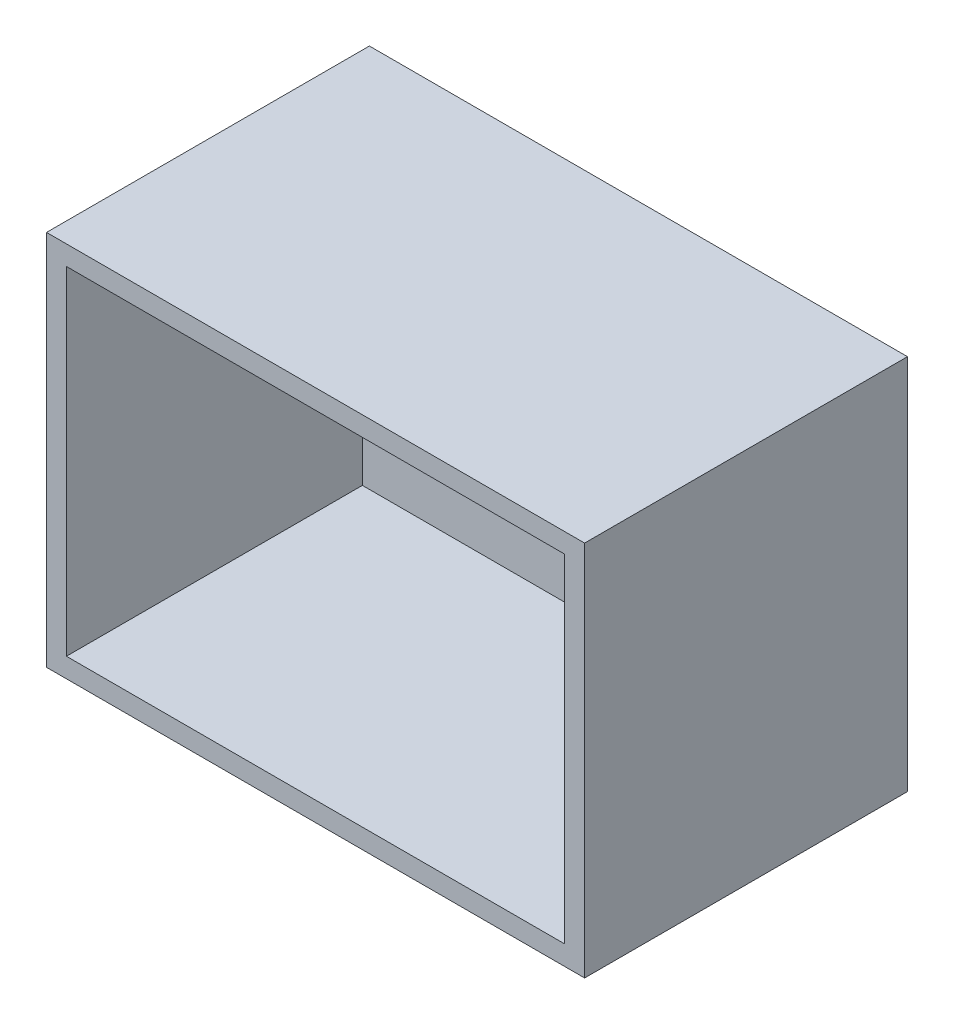
ISO-10303-21;
HEADER;
FILE_DESCRIPTION(('STEP AP214'),'2;1');
FILE_NAME('part.step','',(''),(''),'','','');
FILE_SCHEMA(('AUTOMOTIVE_DESIGN { 1 0 10303 214 1 1 1 1 }'));
ENDSEC;
DATA;
#1=APPLICATION_CONTEXT('core data for automotive mechanical design processes');
#2=APPLICATION_PROTOCOL_DEFINITION('international standard','automotive_design',2000,#1);
#3=PRODUCT_CONTEXT('',#1,'mechanical');
#4=PRODUCT('Part','Part','',(#3));
#5=PRODUCT_RELATED_PRODUCT_CATEGORY('part','',(#4));
#6=PRODUCT_DEFINITION_FORMATION('','',#4);
#7=PRODUCT_DEFINITION_CONTEXT('part definition',#1,'design');
#8=PRODUCT_DEFINITION('design','',#6,#7);
#9=PRODUCT_DEFINITION_SHAPE('','',#8);
#10=(LENGTH_UNIT() NAMED_UNIT(*) SI_UNIT(.MILLI.,.METRE.));
#11=(NAMED_UNIT(*) PLANE_ANGLE_UNIT() SI_UNIT($,.RADIAN.));
#12=(NAMED_UNIT(*) SI_UNIT($,.STERADIAN.) SOLID_ANGLE_UNIT());
#13=UNCERTAINTY_MEASURE_WITH_UNIT(LENGTH_MEASURE(1.E-05),#10,'distance_accuracy_value','');
#14=(GEOMETRIC_REPRESENTATION_CONTEXT(3) GLOBAL_UNCERTAINTY_ASSIGNED_CONTEXT((#13)) GLOBAL_UNIT_ASSIGNED_CONTEXT((#10,
#11,#12)) REPRESENTATION_CONTEXT('',''));
#15=CARTESIAN_POINT('',(0.,0.,0.));
#16=DIRECTION('',(0.,0.,1.));
#17=DIRECTION('',(1.,0.,0.));
#18=AXIS2_PLACEMENT_3D('',#15,#16,#17);
#19=CARTESIAN_POINT('',(0.,0.,60.));
#20=DIRECTION('',(1.,0.,0.));
#21=DIRECTION('',(0.,1.,0.));
#22=AXIS2_PLACEMENT_3D('',#19,#20,#21);
#23=PLANE('',#22);
#24=DIRECTION('',(0.,-1.,0.));
#25=VECTOR('',#24,1.);
#26=CARTESIAN_POINT('',(0.,0.,0.));
#27=LINE('',#26,#25);
#28=CARTESIAN_POINT('',(0.,70.,0.));
#29=VERTEX_POINT('',#28);
#30=CARTESIAN_POINT('',(0.,0.,0.));
#31=VERTEX_POINT('',#30);
#32=EDGE_CURVE('E142',#29,#31,#27,.T.);
#33=ORIENTED_EDGE('',*,*,#32,.T.);
#34=DIRECTION('',(0.,0.,-1.));
#35=VECTOR('',#34,1.);
#36=CARTESIAN_POINT('',(0.,0.,60.));
#37=LINE('',#36,#35);
#38=CARTESIAN_POINT('',(0.,0.,60.));
#39=VERTEX_POINT('',#38);
#40=EDGE_CURVE('E11',#39,#31,#37,.T.);
#41=ORIENTED_EDGE('',*,*,#40,.F.);
#42=DIRECTION('',(0.,-1.,0.));
#43=VECTOR('',#42,1.);
#44=CARTESIAN_POINT('',(0.,0.,60.));
#45=LINE('',#44,#43);
#46=CARTESIAN_POINT('',(0.,70.,60.));
#47=VERTEX_POINT('',#46);
#48=EDGE_CURVE('E146',#47,#39,#45,.T.);
#49=ORIENTED_EDGE('',*,*,#48,.F.);
#50=DIRECTION('',(0.,0.,-1.));
#51=VECTOR('',#50,1.);
#52=CARTESIAN_POINT('',(0.,70.,60.));
#53=LINE('',#52,#51);
#54=EDGE_CURVE('E152',#47,#29,#53,.T.);
#55=ORIENTED_EDGE('',*,*,#54,.T.);
#56=EDGE_LOOP('',(#33,#41,#49,#55));
#57=FACE_BOUND('',#56,.T.);
#58=ADVANCED_FACE('F34',(#57),#23,.F.);
#59=CARTESIAN_POINT('',(0.,0.,60.));
#60=DIRECTION('',(0.,1.,0.));
#61=DIRECTION('',(0.,0.,1.));
#62=AXIS2_PLACEMENT_3D('',#59,#60,#61);
#63=PLANE('',#62);
#64=DIRECTION('',(1.,0.,0.));
#65=VECTOR('',#64,1.);
#66=CARTESIAN_POINT('',(0.,0.,0.));
#67=LINE('',#66,#65);
#68=CARTESIAN_POINT('',(100.,0.,0.));
#69=VERTEX_POINT('',#68);
#70=EDGE_CURVE('E155',#31,#69,#67,.T.);
#71=ORIENTED_EDGE('',*,*,#70,.T.);
#72=DIRECTION('',(0.,0.,-1.));
#73=VECTOR('',#72,1.);
#74=CARTESIAN_POINT('',(100.,0.,60.));
#75=LINE('',#74,#73);
#76=CARTESIAN_POINT('',(100.,0.,60.));
#77=VERTEX_POINT('',#76);
#78=EDGE_CURVE('E41',#77,#69,#75,.T.);
#79=ORIENTED_EDGE('',*,*,#78,.F.);
#80=DIRECTION('',(1.,0.,0.));
#81=VECTOR('',#80,1.);
#82=CARTESIAN_POINT('',(0.,0.,60.));
#83=LINE('',#82,#81);
#84=EDGE_CURVE('E85',#39,#77,#83,.T.);
#85=ORIENTED_EDGE('',*,*,#84,.F.);
#86=ORIENTED_EDGE('',*,*,#40,.T.);
#87=EDGE_LOOP('',(#71,#79,#85,#86));
#88=FACE_BOUND('',#87,.T.);
#89=ADVANCED_FACE('F184',(#88),#63,.F.);
#90=CARTESIAN_POINT('',(100.,0.,60.));
#91=DIRECTION('',(-1.,0.,0.));
#92=DIRECTION('',(0.,-1.,0.));
#93=AXIS2_PLACEMENT_3D('',#90,#91,#92);
#94=PLANE('',#93);
#95=DIRECTION('',(0.,1.,0.));
#96=VECTOR('',#95,1.);
#97=CARTESIAN_POINT('',(100.,0.,0.));
#98=LINE('',#97,#96);
#99=CARTESIAN_POINT('',(100.,70.,0.));
#100=VERTEX_POINT('',#99);
#101=EDGE_CURVE('E157',#69,#100,#98,.T.);
#102=ORIENTED_EDGE('',*,*,#101,.T.);
#103=DIRECTION('',(0.,0.,-1.));
#104=VECTOR('',#103,1.);
#105=CARTESIAN_POINT('',(100.,70.,60.));
#106=LINE('',#105,#104);
#107=CARTESIAN_POINT('',(100.,70.,60.));
#108=VERTEX_POINT('',#107);
#109=EDGE_CURVE('E161',#108,#100,#106,.T.);
#110=ORIENTED_EDGE('',*,*,#109,.F.);
#111=DIRECTION('',(0.,1.,0.));
#112=VECTOR('',#111,1.);
#113=CARTESIAN_POINT('',(100.,0.,60.));
#114=LINE('',#113,#112);
#115=EDGE_CURVE('E149',#77,#108,#114,.T.);
#116=ORIENTED_EDGE('',*,*,#115,.F.);
#117=ORIENTED_EDGE('',*,*,#78,.T.);
#118=EDGE_LOOP('',(#102,#110,#116,#117));
#119=FACE_BOUND('',#118,.T.);
#120=ADVANCED_FACE('F166',(#119),#94,.F.);
#121=CARTESIAN_POINT('',(0.,70.,60.));
#122=DIRECTION('',(0.,-1.,0.));
#123=DIRECTION('',(0.,0.,-1.));
#124=AXIS2_PLACEMENT_3D('',#121,#122,#123);
#125=PLANE('',#124);
#126=DIRECTION('',(-1.,0.,0.));
#127=VECTOR('',#126,1.);
#128=CARTESIAN_POINT('',(0.,70.,0.));
#129=LINE('',#128,#127);
#130=EDGE_CURVE('E78',#100,#29,#129,.T.);
#131=ORIENTED_EDGE('',*,*,#130,.T.);
#132=ORIENTED_EDGE('',*,*,#54,.F.);
#133=DIRECTION('',(-1.,0.,0.));
#134=VECTOR('',#133,1.);
#135=CARTESIAN_POINT('',(0.,70.,60.));
#136=LINE('',#135,#134);
#137=EDGE_CURVE('E57',#108,#47,#136,.T.);
#138=ORIENTED_EDGE('',*,*,#137,.F.);
#139=ORIENTED_EDGE('',*,*,#109,.T.);
#140=EDGE_LOOP('',(#131,#132,#138,#139));
#141=FACE_BOUND('',#140,.T.);
#142=ADVANCED_FACE('F174',(#141),#125,.F.);
#143=CARTESIAN_POINT('',(0.,0.,60.));
#144=DIRECTION('',(0.,0.,-1.));
#145=DIRECTION('',(-1.,0.,0.));
#146=AXIS2_PLACEMENT_3D('',#143,#144,#145);
#147=PLANE('',#146);
#148=DIRECTION('',(-1.,0.,0.));
#149=VECTOR('',#148,1.);
#150=CARTESIAN_POINT('',(3.70057880581975,66.3672183642894,60.));
#151=LINE('',#150,#149);
#152=CARTESIAN_POINT('',(96.2994211941802,66.3672183642894,60.));
#153=VERTEX_POINT('',#152);
#154=CARTESIAN_POINT('',(3.70057880581975,66.3672183642894,60.));
#155=VERTEX_POINT('',#154);
#156=EDGE_CURVE('E136',#153,#155,#151,.T.);
#157=ORIENTED_EDGE('',*,*,#156,.F.);
#158=DIRECTION('',(0.,1.,0.));
#159=VECTOR('',#158,1.);
#160=CARTESIAN_POINT('',(96.2994211941802,3.63278163571057,60.));
#161=LINE('',#160,#159);
#162=CARTESIAN_POINT('',(96.2994211941802,3.63278163571057,60.));
#163=VERTEX_POINT('',#162);
#164=EDGE_CURVE('E48',#163,#153,#161,.T.);
#165=ORIENTED_EDGE('',*,*,#164,.F.);
#166=DIRECTION('',(1.,0.,0.));
#167=VECTOR('',#166,1.);
#168=CARTESIAN_POINT('',(3.70057880581975,3.63278163571057,60.));
#169=LINE('',#168,#167);
#170=CARTESIAN_POINT('',(3.70057880581975,3.63278163571057,60.));
#171=VERTEX_POINT('',#170);
#172=EDGE_CURVE('E127',#171,#163,#169,.T.);
#173=ORIENTED_EDGE('',*,*,#172,.F.);
#174=DIRECTION('',(0.,-1.,0.));
#175=VECTOR('',#174,1.);
#176=CARTESIAN_POINT('',(3.70057880581975,3.63278163571057,60.));
#177=LINE('',#176,#175);
#178=EDGE_CURVE('E130',#155,#171,#177,.T.);
#179=ORIENTED_EDGE('',*,*,#178,.F.);
#180=EDGE_LOOP('',(#157,#165,#173,#179));
#181=FACE_BOUND('',#180,.T.);
#182=ORIENTED_EDGE('',*,*,#48,.T.);
#183=ORIENTED_EDGE('',*,*,#84,.T.);
#184=ORIENTED_EDGE('',*,*,#115,.T.);
#185=ORIENTED_EDGE('',*,*,#137,.T.);
#186=EDGE_LOOP('',(#182,#183,#184,#185));
#187=FACE_BOUND('',#186,.T.);
#188=ADVANCED_FACE('F176',(#181,#187),#147,.F.);
#189=CARTESIAN_POINT('',(0.,0.,0.));
#190=DIRECTION('',(0.,0.,-1.));
#191=DIRECTION('',(-1.,0.,0.));
#192=AXIS2_PLACEMENT_3D('',#189,#190,#191);
#193=PLANE('',#192);
#194=ORIENTED_EDGE('',*,*,#32,.F.);
#195=ORIENTED_EDGE('',*,*,#130,.F.);
#196=ORIENTED_EDGE('',*,*,#101,.F.);
#197=ORIENTED_EDGE('',*,*,#70,.F.);
#198=EDGE_LOOP('',(#194,#195,#196,#197));
#199=FACE_BOUND('',#198,.T.);
#200=ADVANCED_FACE('F170',(#199),#193,.T.);
#201=CARTESIAN_POINT('',(96.2994211941802,3.63278163571057,5.));
#202=DIRECTION('',(1.,0.,0.));
#203=DIRECTION('',(0.,0.,-1.));
#204=AXIS2_PLACEMENT_3D('',#201,#202,#203);
#205=PLANE('',#204);
#206=ORIENTED_EDGE('',*,*,#164,.T.);
#207=DIRECTION('',(0.,0.,1.));
#208=VECTOR('',#207,1.);
#209=CARTESIAN_POINT('',(96.2994211941802,66.3672183642894,5.));
#210=LINE('',#209,#208);
#211=CARTESIAN_POINT('',(96.2994211941802,66.3672183642894,5.));
#212=VERTEX_POINT('',#211);
#213=EDGE_CURVE('E105',#212,#153,#210,.T.);
#214=ORIENTED_EDGE('',*,*,#213,.F.);
#215=DIRECTION('',(0.,1.,0.));
#216=VECTOR('',#215,1.);
#217=CARTESIAN_POINT('',(96.2994211941802,3.63278163571057,5.));
#218=LINE('',#217,#216);
#219=CARTESIAN_POINT('',(96.2994211941802,3.63278163571057,5.));
#220=VERTEX_POINT('',#219);
#221=EDGE_CURVE('E109',#220,#212,#218,.T.);
#222=ORIENTED_EDGE('',*,*,#221,.F.);
#223=DIRECTION('',(0.,0.,1.));
#224=VECTOR('',#223,1.);
#225=CARTESIAN_POINT('',(96.2994211941802,3.63278163571057,5.));
#226=LINE('',#225,#224);
#227=EDGE_CURVE('E140',#220,#163,#226,.T.);
#228=ORIENTED_EDGE('',*,*,#227,.T.);
#229=EDGE_LOOP('',(#206,#214,#222,#228));
#230=FACE_BOUND('',#229,.T.);
#231=ADVANCED_FACE('F107',(#230),#205,.F.);
#232=CARTESIAN_POINT('',(3.70057880581975,3.63278163571057,5.));
#233=DIRECTION('',(0.,-1.,0.));
#234=DIRECTION('',(0.,0.,-1.));
#235=AXIS2_PLACEMENT_3D('',#232,#233,#234);
#236=PLANE('',#235);
#237=ORIENTED_EDGE('',*,*,#172,.T.);
#238=ORIENTED_EDGE('',*,*,#227,.F.);
#239=DIRECTION('',(1.,0.,0.));
#240=VECTOR('',#239,1.);
#241=CARTESIAN_POINT('',(3.70057880581975,3.63278163571057,5.));
#242=LINE('',#241,#240);
#243=CARTESIAN_POINT('',(3.70057880581975,3.63278163571057,5.));
#244=VERTEX_POINT('',#243);
#245=EDGE_CURVE('E115',#244,#220,#242,.T.);
#246=ORIENTED_EDGE('',*,*,#245,.F.);
#247=DIRECTION('',(0.,0.,1.));
#248=VECTOR('',#247,1.);
#249=CARTESIAN_POINT('',(3.70057880581975,3.63278163571057,5.));
#250=LINE('',#249,#248);
#251=EDGE_CURVE('E143',#244,#171,#250,.T.);
#252=ORIENTED_EDGE('',*,*,#251,.T.);
#253=EDGE_LOOP('',(#237,#238,#246,#252));
#254=FACE_BOUND('',#253,.T.);
#255=ADVANCED_FACE('F223',(#254),#236,.F.);
#256=CARTESIAN_POINT('',(3.70057880581975,3.63278163571057,5.));
#257=DIRECTION('',(-1.,0.,0.));
#258=DIRECTION('',(0.,0.,1.));
#259=AXIS2_PLACEMENT_3D('',#256,#257,#258);
#260=PLANE('',#259);
#261=ORIENTED_EDGE('',*,*,#178,.T.);
#262=ORIENTED_EDGE('',*,*,#251,.F.);
#263=DIRECTION('',(0.,-1.,0.));
#264=VECTOR('',#263,1.);
#265=CARTESIAN_POINT('',(3.70057880581975,3.63278163571057,5.));
#266=LINE('',#265,#264);
#267=CARTESIAN_POINT('',(3.70057880581975,66.3672183642894,5.));
#268=VERTEX_POINT('',#267);
#269=EDGE_CURVE('E123',#268,#244,#266,.T.);
#270=ORIENTED_EDGE('',*,*,#269,.F.);
#271=DIRECTION('',(0.,0.,1.));
#272=VECTOR('',#271,1.);
#273=CARTESIAN_POINT('',(3.70057880581975,66.3672183642894,5.));
#274=LINE('',#273,#272);
#275=EDGE_CURVE('E114',#268,#155,#274,.T.);
#276=ORIENTED_EDGE('',*,*,#275,.T.);
#277=EDGE_LOOP('',(#261,#262,#270,#276));
#278=FACE_BOUND('',#277,.T.);
#279=ADVANCED_FACE('F232',(#278),#260,.F.);
#280=CARTESIAN_POINT('',(3.70057880581975,66.3672183642894,5.));
#281=DIRECTION('',(0.,1.,0.));
#282=DIRECTION('',(0.,0.,1.));
#283=AXIS2_PLACEMENT_3D('',#280,#281,#282);
#284=PLANE('',#283);
#285=ORIENTED_EDGE('',*,*,#156,.T.);
#286=ORIENTED_EDGE('',*,*,#275,.F.);
#287=DIRECTION('',(-1.,0.,0.));
#288=VECTOR('',#287,1.);
#289=CARTESIAN_POINT('',(3.70057880581975,66.3672183642894,5.));
#290=LINE('',#289,#288);
#291=EDGE_CURVE('E118',#212,#268,#290,.T.);
#292=ORIENTED_EDGE('',*,*,#291,.F.);
#293=ORIENTED_EDGE('',*,*,#213,.T.);
#294=EDGE_LOOP('',(#285,#286,#292,#293));
#295=FACE_BOUND('',#294,.T.);
#296=ADVANCED_FACE('F119',(#295),#284,.F.);
#297=CARTESIAN_POINT('',(0.,0.,5.));
#298=DIRECTION('',(0.,0.,-1.));
#299=DIRECTION('',(-1.,0.,0.));
#300=AXIS2_PLACEMENT_3D('',#297,#298,#299);
#301=PLANE('',#300);
#302=ORIENTED_EDGE('',*,*,#221,.T.);
#303=ORIENTED_EDGE('',*,*,#291,.T.);
#304=ORIENTED_EDGE('',*,*,#269,.T.);
#305=ORIENTED_EDGE('',*,*,#245,.T.);
#306=EDGE_LOOP('',(#302,#303,#304,#305));
#307=FACE_BOUND('',#306,.T.);
#308=ADVANCED_FACE('F125',(#307),#301,.F.);
#309=CLOSED_SHELL('',(#58,#89,#120,#142,#188,#200,#231,#255,#279,#296,#308));
#310=MANIFOLD_SOLID_BREP('B2',#309);
#311=ADVANCED_BREP_SHAPE_REPRESENTATION('',(#18,#310),#14);
#312=SHAPE_DEFINITION_REPRESENTATION(#9,#311);
ENDSEC;
END-ISO-10303-21;
